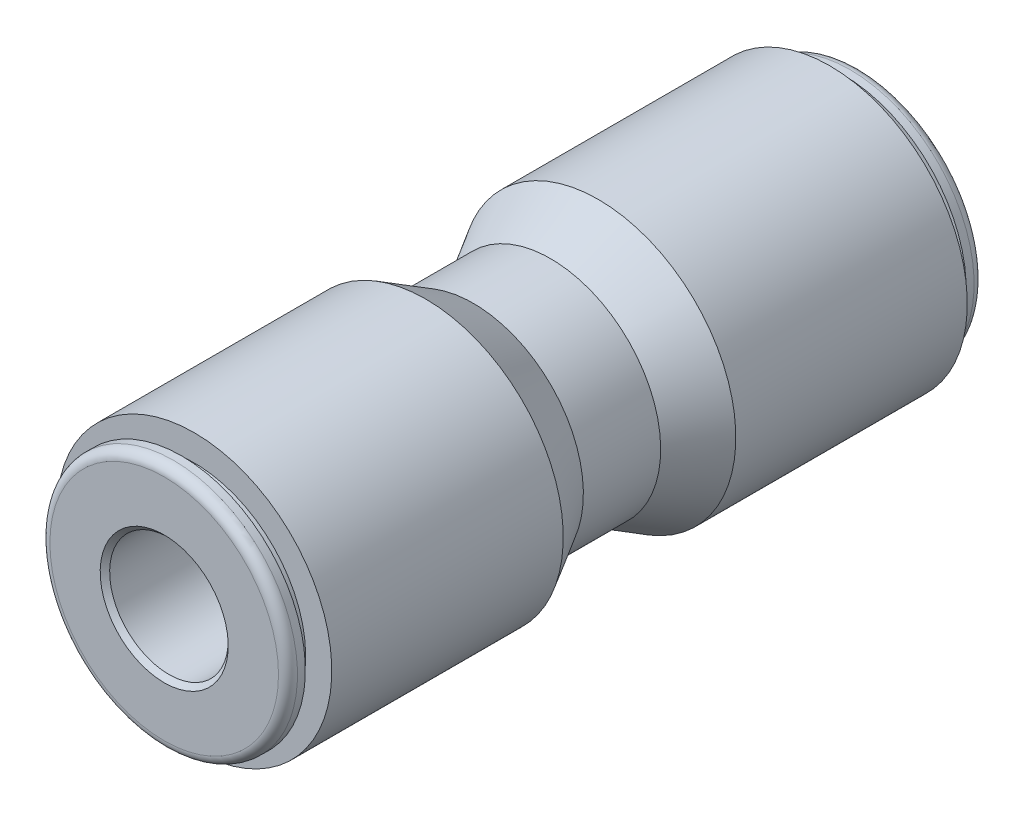
ISO-10303-21;
HEADER;
FILE_DESCRIPTION(('STEP AP214'),'2;1');
FILE_NAME('part.step','',(''),(''),'','','');
FILE_SCHEMA(('AUTOMOTIVE_DESIGN { 1 0 10303 214 1 1 1 1 }'));
ENDSEC;
DATA;
#1=APPLICATION_CONTEXT('core data for automotive mechanical design processes');
#2=APPLICATION_PROTOCOL_DEFINITION('international standard','automotive_design',2000,#1);
#3=PRODUCT_CONTEXT('',#1,'mechanical');
#4=PRODUCT('Part','Part','',(#3));
#5=PRODUCT_RELATED_PRODUCT_CATEGORY('part','',(#4));
#6=PRODUCT_DEFINITION_FORMATION('','',#4);
#7=PRODUCT_DEFINITION_CONTEXT('part definition',#1,'design');
#8=PRODUCT_DEFINITION('design','',#6,#7);
#9=PRODUCT_DEFINITION_SHAPE('','',#8);
#10=(LENGTH_UNIT() NAMED_UNIT(*) SI_UNIT(.MILLI.,.METRE.));
#11=(NAMED_UNIT(*) PLANE_ANGLE_UNIT() SI_UNIT($,.RADIAN.));
#12=(NAMED_UNIT(*) SI_UNIT($,.STERADIAN.) SOLID_ANGLE_UNIT());
#13=UNCERTAINTY_MEASURE_WITH_UNIT(LENGTH_MEASURE(1.E-05),#10,'distance_accuracy_value','');
#14=(GEOMETRIC_REPRESENTATION_CONTEXT(3) GLOBAL_UNCERTAINTY_ASSIGNED_CONTEXT((#13)) GLOBAL_UNIT_ASSIGNED_CONTEXT((#10,
#11,#12)) REPRESENTATION_CONTEXT('',''));
#15=CARTESIAN_POINT('',(0.,0.,0.));
#16=DIRECTION('',(0.,0.,1.));
#17=DIRECTION('',(1.,0.,0.));
#18=AXIS2_PLACEMENT_3D('',#15,#16,#17);
#19=CARTESIAN_POINT('',(0.,0.,0.));
#20=DIRECTION('',(0.,0.,1.));
#21=DIRECTION('',(0.,-1.,0.));
#22=AXIS2_PLACEMENT_3D('',#19,#20,#21);
#23=CYLINDRICAL_SURFACE('',#22,8.8392);
#24=CARTESIAN_POINT('',(0.,0.,3.10444444444445));
#25=DIRECTION('',(0.,0.,1.));
#26=DIRECTION('',(0.,-1.,0.));
#27=AXIS2_PLACEMENT_3D('',#24,#25,#26);
#28=CIRCLE('',#27,8.8392);
#29=CARTESIAN_POINT('',(0.,-8.8392,3.10444444444445));
#30=VERTEX_POINT('',#29);
#31=EDGE_CURVE('E108',#30,#30,#28,.T.);
#32=ORIENTED_EDGE('',*,*,#31,.F.);
#33=EDGE_LOOP('',(#32));
#34=FACE_BOUND('',#33,.T.);
#35=CARTESIAN_POINT('',(0.,0.,-3.10444444444445));
#36=DIRECTION('',(0.,0.,1.));
#37=DIRECTION('',(0.,-1.,0.));
#38=AXIS2_PLACEMENT_3D('',#35,#36,#37);
#39=CIRCLE('',#38,8.8392);
#40=CARTESIAN_POINT('',(0.,-8.8392,-3.10444444444445));
#41=VERTEX_POINT('',#40);
#42=EDGE_CURVE('E10',#41,#41,#39,.T.);
#43=ORIENTED_EDGE('',*,*,#42,.T.);
#44=EDGE_LOOP('',(#43));
#45=FACE_BOUND('',#44,.T.);
#46=ADVANCED_FACE('F32',(#34,#45),#23,.T.);
#47=CARTESIAN_POINT('',(0.,0.,-6.93193031901014));
#48=DIRECTION('',(0.,0.,-1.));
#49=DIRECTION('',(0.,1.,0.));
#50=AXIS2_PLACEMENT_3D('',#47,#48,#49);
#51=CONICAL_SURFACE('',#50,11.049,0.523598775598301);
#52=ORIENTED_EDGE('',*,*,#42,.F.);
#53=EDGE_LOOP('',(#52));
#54=FACE_BOUND('',#53,.T.);
#55=CARTESIAN_POINT('',(0.,0.,-6.93193031901014));
#56=DIRECTION('',(0.,0.,1.));
#57=DIRECTION('',(0.,-1.,0.));
#58=AXIS2_PLACEMENT_3D('',#55,#56,#57);
#59=CIRCLE('',#58,11.049);
#60=CARTESIAN_POINT('',(0.,-11.049,-6.93193031901014));
#61=VERTEX_POINT('',#60);
#62=EDGE_CURVE('E38',#61,#61,#59,.T.);
#63=ORIENTED_EDGE('',*,*,#62,.T.);
#64=EDGE_LOOP('',(#63));
#65=FACE_BOUND('',#64,.T.);
#66=ADVANCED_FACE('F115',(#54,#65),#51,.T.);
#67=CARTESIAN_POINT('',(0.,0.,0.));
#68=DIRECTION('',(0.,0.,1.));
#69=DIRECTION('',(0.,-1.,0.));
#70=AXIS2_PLACEMENT_3D('',#67,#68,#69);
#71=CYLINDRICAL_SURFACE('',#70,11.049);
#72=ORIENTED_EDGE('',*,*,#62,.F.);
#73=EDGE_LOOP('',(#72));
#74=FACE_BOUND('',#73,.T.);
#75=CARTESIAN_POINT('',(0.,0.,-25.527));
#76=DIRECTION('',(0.,0.,1.));
#77=DIRECTION('',(0.,-1.,0.));
#78=AXIS2_PLACEMENT_3D('',#75,#76,#77);
#79=CIRCLE('',#78,11.049);
#80=CARTESIAN_POINT('',(0.,-11.049,-25.527));
#81=VERTEX_POINT('',#80);
#82=EDGE_CURVE('E42',#81,#81,#79,.T.);
#83=ORIENTED_EDGE('',*,*,#82,.T.);
#84=EDGE_LOOP('',(#83));
#85=FACE_BOUND('',#84,.T.);
#86=ADVANCED_FACE('F119',(#74,#85),#71,.T.);
#87=CARTESIAN_POINT('',(0.,11.049,-25.527));
#88=DIRECTION('',(0.,0.,1.));
#89=DIRECTION('',(0.,-1.,0.));
#90=AXIS2_PLACEMENT_3D('',#87,#88,#89);
#91=PLANE('',#90);
#92=ORIENTED_EDGE('',*,*,#82,.F.);
#93=EDGE_LOOP('',(#92));
#94=FACE_BOUND('',#93,.T.);
#95=CARTESIAN_POINT('',(0.,0.,-25.527));
#96=DIRECTION('',(0.,0.,1.));
#97=DIRECTION('',(0.,-1.,0.));
#98=AXIS2_PLACEMENT_3D('',#95,#96,#97);
#99=CIRCLE('',#98,8.94969);
#100=CARTESIAN_POINT('',(0.,-8.94969,-25.527));
#101=VERTEX_POINT('',#100);
#102=EDGE_CURVE('E46',#101,#101,#99,.T.);
#103=ORIENTED_EDGE('',*,*,#102,.T.);
#104=EDGE_LOOP('',(#103));
#105=FACE_BOUND('',#104,.T.);
#106=ADVANCED_FACE('F124',(#94,#105),#91,.F.);
#107=CARTESIAN_POINT('',(0.,0.,0.));
#108=DIRECTION('',(0.,0.,1.));
#109=DIRECTION('',(0.,-1.,0.));
#110=AXIS2_PLACEMENT_3D('',#107,#108,#109);
#111=CYLINDRICAL_SURFACE('',#110,8.94969);
#112=ORIENTED_EDGE('',*,*,#102,.F.);
#113=EDGE_LOOP('',(#112));
#114=FACE_BOUND('',#113,.T.);
#115=CARTESIAN_POINT('',(0.,0.,-26.543));
#116=DIRECTION('',(0.,0.,1.));
#117=DIRECTION('',(0.,-1.,0.));
#118=AXIS2_PLACEMENT_3D('',#115,#116,#117);
#119=CIRCLE('',#118,8.94969);
#120=CARTESIAN_POINT('',(0.,-8.94969,-26.543));
#121=VERTEX_POINT('',#120);
#122=EDGE_CURVE('E51',#121,#121,#119,.T.);
#123=ORIENTED_EDGE('',*,*,#122,.T.);
#124=EDGE_LOOP('',(#123));
#125=FACE_BOUND('',#124,.T.);
#126=ADVANCED_FACE('F130',(#114,#125),#111,.T.);
#127=CARTESIAN_POINT('',(0.,9.9441,-26.543));
#128=DIRECTION('',(0.,0.,-1.));
#129=DIRECTION('',(0.,1.,0.));
#130=AXIS2_PLACEMENT_3D('',#127,#128,#129);
#131=PLANE('',#130);
#132=ORIENTED_EDGE('',*,*,#122,.F.);
#133=EDGE_LOOP('',(#132));
#134=FACE_BOUND('',#133,.T.);
#135=CARTESIAN_POINT('',(0.,0.,-26.543));
#136=DIRECTION('',(0.,0.,1.));
#137=DIRECTION('',(0.,-1.,0.));
#138=AXIS2_PLACEMENT_3D('',#135,#136,#137);
#139=CIRCLE('',#138,9.9441);
#140=CARTESIAN_POINT('',(0.,-9.9441,-26.543));
#141=VERTEX_POINT('',#140);
#142=EDGE_CURVE('E54',#141,#141,#139,.T.);
#143=ORIENTED_EDGE('',*,*,#142,.T.);
#144=EDGE_LOOP('',(#143));
#145=FACE_BOUND('',#144,.T.);
#146=ADVANCED_FACE('F134',(#134,#145),#131,.F.);
#147=CARTESIAN_POINT('',(0.,0.,0.));
#148=DIRECTION('',(0.,0.,1.));
#149=DIRECTION('',(0.,-1.,0.));
#150=AXIS2_PLACEMENT_3D('',#147,#148,#149);
#151=CYLINDRICAL_SURFACE('',#150,9.9441);
#152=ORIENTED_EDGE('',*,*,#142,.F.);
#153=EDGE_LOOP('',(#152));
#154=FACE_BOUND('',#153,.T.);
#155=CARTESIAN_POINT('',(0.,0.,-27.178));
#156=DIRECTION('',(0.,0.,1.));
#157=DIRECTION('',(0.,-1.,0.));
#158=AXIS2_PLACEMENT_3D('',#155,#156,#157);
#159=CIRCLE('',#158,9.9441);
#160=CARTESIAN_POINT('',(0.,-9.9441,-27.178));
#161=VERTEX_POINT('',#160);
#162=EDGE_CURVE('E57',#161,#161,#159,.T.);
#163=ORIENTED_EDGE('',*,*,#162,.T.);
#164=EDGE_LOOP('',(#163));
#165=FACE_BOUND('',#164,.T.);
#166=ADVANCED_FACE('F138',(#154,#165),#151,.T.);
#167=CARTESIAN_POINT('',(0.,0.,-27.178));
#168=DIRECTION('',(0.,0.,1.));
#169=DIRECTION('',(0.,-1.,0.));
#170=AXIS2_PLACEMENT_3D('',#167,#168,#169);
#171=TOROIDAL_SURFACE('',#170,9.1821,0.761999999999997);
#172=ORIENTED_EDGE('',*,*,#162,.F.);
#173=EDGE_LOOP('',(#172));
#174=FACE_BOUND('',#173,.T.);
#175=CARTESIAN_POINT('',(0.,0.,-27.94));
#176=DIRECTION('',(0.,0.,1.));
#177=DIRECTION('',(0.,-1.,0.));
#178=AXIS2_PLACEMENT_3D('',#175,#176,#177);
#179=CIRCLE('',#178,9.1821);
#180=CARTESIAN_POINT('',(0.,-9.1821,-27.94));
#181=VERTEX_POINT('',#180);
#182=EDGE_CURVE('E60',#181,#181,#179,.T.);
#183=ORIENTED_EDGE('',*,*,#182,.T.);
#184=EDGE_LOOP('',(#183));
#185=FACE_BOUND('',#184,.T.);
#186=ADVANCED_FACE('F142',(#174,#185),#171,.T.);
#187=CARTESIAN_POINT('',(0.,9.1821,-27.94));
#188=DIRECTION('',(0.,0.,1.));
#189=DIRECTION('',(0.,-1.,0.));
#190=AXIS2_PLACEMENT_3D('',#187,#188,#189);
#191=PLANE('',#190);
#192=ORIENTED_EDGE('',*,*,#182,.F.);
#193=EDGE_LOOP('',(#192));
#194=FACE_BOUND('',#193,.T.);
#195=CARTESIAN_POINT('',(0.,0.,-27.94));
#196=DIRECTION('',(0.,0.,1.));
#197=DIRECTION('',(0.,-1.,0.));
#198=AXIS2_PLACEMENT_3D('',#195,#196,#197);
#199=CIRCLE('',#198,6.731);
#200=CARTESIAN_POINT('',(0.,-6.731,-27.94));
#201=VERTEX_POINT('',#200);
#202=EDGE_CURVE('E63',#201,#201,#199,.T.);
#203=ORIENTED_EDGE('',*,*,#202,.T.);
#204=EDGE_LOOP('',(#203));
#205=FACE_BOUND('',#204,.T.);
#206=ADVANCED_FACE('F146',(#194,#205),#191,.F.);
#207=CARTESIAN_POINT('',(0.,0.,-27.559));
#208=DIRECTION('',(0.,0.,-1.));
#209=DIRECTION('',(0.,1.,0.));
#210=AXIS2_PLACEMENT_3D('',#207,#208,#209);
#211=CONICAL_SURFACE('',#210,6.35,0.785398163397457);
#212=ORIENTED_EDGE('',*,*,#202,.F.);
#213=EDGE_LOOP('',(#212));
#214=FACE_BOUND('',#213,.T.);
#215=CARTESIAN_POINT('',(0.,0.,-27.559));
#216=DIRECTION('',(0.,0.,1.));
#217=DIRECTION('',(0.,-1.,0.));
#218=AXIS2_PLACEMENT_3D('',#215,#216,#217);
#219=CIRCLE('',#218,6.35);
#220=CARTESIAN_POINT('',(0.,-6.35,-27.559));
#221=VERTEX_POINT('',#220);
#222=EDGE_CURVE('E66',#221,#221,#219,.T.);
#223=ORIENTED_EDGE('',*,*,#222,.T.);
#224=EDGE_LOOP('',(#223));
#225=FACE_BOUND('',#224,.T.);
#226=ADVANCED_FACE('F150',(#214,#225),#211,.F.);
#227=CARTESIAN_POINT('',(0.,0.,0.));
#228=DIRECTION('',(0.,0.,1.));
#229=DIRECTION('',(0.,-1.,0.));
#230=AXIS2_PLACEMENT_3D('',#227,#228,#229);
#231=CYLINDRICAL_SURFACE('',#230,6.35);
#232=ORIENTED_EDGE('',*,*,#222,.F.);
#233=EDGE_LOOP('',(#232));
#234=FACE_BOUND('',#233,.T.);
#235=CARTESIAN_POINT('',(0.,0.,-0.254000000000004));
#236=DIRECTION('',(0.,0.,1.));
#237=DIRECTION('',(0.,-1.,0.));
#238=AXIS2_PLACEMENT_3D('',#235,#236,#237);
#239=CIRCLE('',#238,6.35);
#240=CARTESIAN_POINT('',(0.,-6.35,-0.254000000000004));
#241=VERTEX_POINT('',#240);
#242=EDGE_CURVE('E69',#241,#241,#239,.T.);
#243=ORIENTED_EDGE('',*,*,#242,.T.);
#244=EDGE_LOOP('',(#243));
#245=FACE_BOUND('',#244,.T.);
#246=ADVANCED_FACE('F154',(#234,#245),#231,.F.);
#247=CARTESIAN_POINT('',(0.,6.35,-0.254000000000004));
#248=DIRECTION('',(0.,0.,1.));
#249=DIRECTION('',(0.,-1.,0.));
#250=AXIS2_PLACEMENT_3D('',#247,#248,#249);
#251=PLANE('',#250);
#252=ORIENTED_EDGE('',*,*,#242,.F.);
#253=EDGE_LOOP('',(#252));
#254=FACE_BOUND('',#253,.T.);
#255=CARTESIAN_POINT('',(0.,0.,-0.254000000000004));
#256=DIRECTION('',(0.,0.,1.));
#257=DIRECTION('',(0.,-1.,0.));
#258=AXIS2_PLACEMENT_3D('',#255,#256,#257);
#259=CIRCLE('',#258,3.175);
#260=CARTESIAN_POINT('',(0.,-3.175,-0.254000000000004));
#261=VERTEX_POINT('',#260);
#262=EDGE_CURVE('E72',#261,#261,#259,.T.);
#263=ORIENTED_EDGE('',*,*,#262,.T.);
#264=EDGE_LOOP('',(#263));
#265=FACE_BOUND('',#264,.T.);
#266=ADVANCED_FACE('F158',(#254,#265),#251,.F.);
#267=CARTESIAN_POINT('',(0.,0.,0.));
#268=DIRECTION('',(0.,0.,1.));
#269=DIRECTION('',(0.,-1.,0.));
#270=AXIS2_PLACEMENT_3D('',#267,#268,#269);
#271=CYLINDRICAL_SURFACE('',#270,3.175);
#272=ORIENTED_EDGE('',*,*,#262,.F.);
#273=EDGE_LOOP('',(#272));
#274=FACE_BOUND('',#273,.T.);
#275=CARTESIAN_POINT('',(0.,0.,7.112));
#276=DIRECTION('',(0.,0.,1.));
#277=DIRECTION('',(0.,-1.,0.));
#278=AXIS2_PLACEMENT_3D('',#275,#276,#277);
#279=CIRCLE('',#278,3.175);
#280=CARTESIAN_POINT('',(0.,-3.175,7.112));
#281=VERTEX_POINT('',#280);
#282=EDGE_CURVE('E75',#281,#281,#279,.T.);
#283=ORIENTED_EDGE('',*,*,#282,.T.);
#284=EDGE_LOOP('',(#283));
#285=FACE_BOUND('',#284,.T.);
#286=ADVANCED_FACE('F162',(#274,#285),#271,.F.);
#287=CARTESIAN_POINT('',(0.,3.175,7.112));
#288=DIRECTION('',(0.,0.,-1.));
#289=DIRECTION('',(0.,1.,0.));
#290=AXIS2_PLACEMENT_3D('',#287,#288,#289);
#291=PLANE('',#290);
#292=ORIENTED_EDGE('',*,*,#282,.F.);
#293=EDGE_LOOP('',(#292));
#294=FACE_BOUND('',#293,.T.);
#295=CARTESIAN_POINT('',(0.,0.,7.112));
#296=DIRECTION('',(0.,0.,1.));
#297=DIRECTION('',(0.,-1.,0.));
#298=AXIS2_PLACEMENT_3D('',#295,#296,#297);
#299=CIRCLE('',#298,4.7625);
#300=CARTESIAN_POINT('',(0.,-4.7625,7.112));
#301=VERTEX_POINT('',#300);
#302=EDGE_CURVE('E78',#301,#301,#299,.T.);
#303=ORIENTED_EDGE('',*,*,#302,.T.);
#304=EDGE_LOOP('',(#303));
#305=FACE_BOUND('',#304,.T.);
#306=ADVANCED_FACE('F166',(#294,#305),#291,.F.);
#307=CARTESIAN_POINT('',(0.,0.,0.));
#308=DIRECTION('',(0.,0.,1.));
#309=DIRECTION('',(0.,-1.,0.));
#310=AXIS2_PLACEMENT_3D('',#307,#308,#309);
#311=CYLINDRICAL_SURFACE('',#310,4.7625);
#312=ORIENTED_EDGE('',*,*,#302,.F.);
#313=EDGE_LOOP('',(#312));
#314=FACE_BOUND('',#313,.T.);
#315=CARTESIAN_POINT('',(0.,0.,27.559));
#316=DIRECTION('',(0.,0.,1.));
#317=DIRECTION('',(0.,-1.,0.));
#318=AXIS2_PLACEMENT_3D('',#315,#316,#317);
#319=CIRCLE('',#318,4.7625);
#320=CARTESIAN_POINT('',(0.,-4.7625,27.559));
#321=VERTEX_POINT('',#320);
#322=EDGE_CURVE('E81',#321,#321,#319,.T.);
#323=ORIENTED_EDGE('',*,*,#322,.T.);
#324=EDGE_LOOP('',(#323));
#325=FACE_BOUND('',#324,.T.);
#326=ADVANCED_FACE('F170',(#314,#325),#311,.F.);
#327=CARTESIAN_POINT('',(0.,0.,27.94));
#328=DIRECTION('',(0.,0.,1.));
#329=DIRECTION('',(0.,-1.,0.));
#330=AXIS2_PLACEMENT_3D('',#327,#328,#329);
#331=CONICAL_SURFACE('',#330,5.1435,0.785398163397444);
#332=ORIENTED_EDGE('',*,*,#322,.F.);
#333=EDGE_LOOP('',(#332));
#334=FACE_BOUND('',#333,.T.);
#335=CARTESIAN_POINT('',(0.,0.,27.94));
#336=DIRECTION('',(0.,0.,1.));
#337=DIRECTION('',(0.,-1.,0.));
#338=AXIS2_PLACEMENT_3D('',#335,#336,#337);
#339=CIRCLE('',#338,5.1435);
#340=CARTESIAN_POINT('',(0.,-5.1435,27.94));
#341=VERTEX_POINT('',#340);
#342=EDGE_CURVE('E84',#341,#341,#339,.T.);
#343=ORIENTED_EDGE('',*,*,#342,.T.);
#344=EDGE_LOOP('',(#343));
#345=FACE_BOUND('',#344,.T.);
#346=ADVANCED_FACE('F174',(#334,#345),#331,.F.);
#347=CARTESIAN_POINT('',(0.,9.1821,27.94));
#348=DIRECTION('',(0.,0.,-1.));
#349=DIRECTION('',(0.,1.,0.));
#350=AXIS2_PLACEMENT_3D('',#347,#348,#349);
#351=PLANE('',#350);
#352=ORIENTED_EDGE('',*,*,#342,.F.);
#353=EDGE_LOOP('',(#352));
#354=FACE_BOUND('',#353,.T.);
#355=CARTESIAN_POINT('',(0.,0.,27.94));
#356=DIRECTION('',(0.,0.,1.));
#357=DIRECTION('',(0.,-1.,0.));
#358=AXIS2_PLACEMENT_3D('',#355,#356,#357);
#359=CIRCLE('',#358,9.1821);
#360=CARTESIAN_POINT('',(0.,-9.1821,27.94));
#361=VERTEX_POINT('',#360);
#362=EDGE_CURVE('E87',#361,#361,#359,.T.);
#363=ORIENTED_EDGE('',*,*,#362,.T.);
#364=EDGE_LOOP('',(#363));
#365=FACE_BOUND('',#364,.T.);
#366=ADVANCED_FACE('F178',(#354,#365),#351,.F.);
#367=CARTESIAN_POINT('',(0.,0.,27.178));
#368=DIRECTION('',(0.,0.,1.));
#369=DIRECTION('',(0.,-1.,0.));
#370=AXIS2_PLACEMENT_3D('',#367,#368,#369);
#371=TOROIDAL_SURFACE('',#370,9.1821,0.761999999999997);
#372=ORIENTED_EDGE('',*,*,#362,.F.);
#373=EDGE_LOOP('',(#372));
#374=FACE_BOUND('',#373,.T.);
#375=CARTESIAN_POINT('',(0.,0.,27.178));
#376=DIRECTION('',(0.,0.,1.));
#377=DIRECTION('',(0.,-1.,0.));
#378=AXIS2_PLACEMENT_3D('',#375,#376,#377);
#379=CIRCLE('',#378,9.9441);
#380=CARTESIAN_POINT('',(0.,-9.9441,27.178));
#381=VERTEX_POINT('',#380);
#382=EDGE_CURVE('E90',#381,#381,#379,.T.);
#383=ORIENTED_EDGE('',*,*,#382,.T.);
#384=EDGE_LOOP('',(#383));
#385=FACE_BOUND('',#384,.T.);
#386=ADVANCED_FACE('F182',(#374,#385),#371,.T.);
#387=CARTESIAN_POINT('',(0.,0.,0.));
#388=DIRECTION('',(0.,0.,1.));
#389=DIRECTION('',(0.,-1.,0.));
#390=AXIS2_PLACEMENT_3D('',#387,#388,#389);
#391=CYLINDRICAL_SURFACE('',#390,9.9441);
#392=ORIENTED_EDGE('',*,*,#382,.F.);
#393=EDGE_LOOP('',(#392));
#394=FACE_BOUND('',#393,.T.);
#395=CARTESIAN_POINT('',(0.,0.,26.543));
#396=DIRECTION('',(0.,0.,1.));
#397=DIRECTION('',(0.,-1.,0.));
#398=AXIS2_PLACEMENT_3D('',#395,#396,#397);
#399=CIRCLE('',#398,9.9441);
#400=CARTESIAN_POINT('',(0.,-9.9441,26.543));
#401=VERTEX_POINT('',#400);
#402=EDGE_CURVE('E93',#401,#401,#399,.T.);
#403=ORIENTED_EDGE('',*,*,#402,.T.);
#404=EDGE_LOOP('',(#403));
#405=FACE_BOUND('',#404,.T.);
#406=ADVANCED_FACE('F186',(#394,#405),#391,.T.);
#407=CARTESIAN_POINT('',(0.,9.9441,26.543));
#408=DIRECTION('',(0.,0.,1.));
#409=DIRECTION('',(0.,-1.,0.));
#410=AXIS2_PLACEMENT_3D('',#407,#408,#409);
#411=PLANE('',#410);
#412=ORIENTED_EDGE('',*,*,#402,.F.);
#413=EDGE_LOOP('',(#412));
#414=FACE_BOUND('',#413,.T.);
#415=CARTESIAN_POINT('',(0.,0.,26.543));
#416=DIRECTION('',(0.,0.,1.));
#417=DIRECTION('',(0.,-1.,0.));
#418=AXIS2_PLACEMENT_3D('',#415,#416,#417);
#419=CIRCLE('',#418,8.94969);
#420=CARTESIAN_POINT('',(0.,-8.94969,26.543));
#421=VERTEX_POINT('',#420);
#422=EDGE_CURVE('E96',#421,#421,#419,.T.);
#423=ORIENTED_EDGE('',*,*,#422,.T.);
#424=EDGE_LOOP('',(#423));
#425=FACE_BOUND('',#424,.T.);
#426=ADVANCED_FACE('F190',(#414,#425),#411,.F.);
#427=CARTESIAN_POINT('',(0.,0.,0.));
#428=DIRECTION('',(0.,0.,1.));
#429=DIRECTION('',(0.,-1.,0.));
#430=AXIS2_PLACEMENT_3D('',#427,#428,#429);
#431=CYLINDRICAL_SURFACE('',#430,8.94969);
#432=ORIENTED_EDGE('',*,*,#422,.F.);
#433=EDGE_LOOP('',(#432));
#434=FACE_BOUND('',#433,.T.);
#435=CARTESIAN_POINT('',(0.,0.,25.527));
#436=DIRECTION('',(0.,0.,1.));
#437=DIRECTION('',(0.,-1.,0.));
#438=AXIS2_PLACEMENT_3D('',#435,#436,#437);
#439=CIRCLE('',#438,8.94969);
#440=CARTESIAN_POINT('',(0.,-8.94969,25.527));
#441=VERTEX_POINT('',#440);
#442=EDGE_CURVE('E99',#441,#441,#439,.T.);
#443=ORIENTED_EDGE('',*,*,#442,.T.);
#444=EDGE_LOOP('',(#443));
#445=FACE_BOUND('',#444,.T.);
#446=ADVANCED_FACE('F194',(#434,#445),#431,.T.);
#447=CARTESIAN_POINT('',(0.,11.049,25.527));
#448=DIRECTION('',(0.,0.,-1.));
#449=DIRECTION('',(0.,1.,0.));
#450=AXIS2_PLACEMENT_3D('',#447,#448,#449);
#451=PLANE('',#450);
#452=ORIENTED_EDGE('',*,*,#442,.F.);
#453=EDGE_LOOP('',(#452));
#454=FACE_BOUND('',#453,.T.);
#455=CARTESIAN_POINT('',(0.,0.,25.527));
#456=DIRECTION('',(0.,0.,1.));
#457=DIRECTION('',(0.,-1.,0.));
#458=AXIS2_PLACEMENT_3D('',#455,#456,#457);
#459=CIRCLE('',#458,11.049);
#460=CARTESIAN_POINT('',(0.,-11.049,25.527));
#461=VERTEX_POINT('',#460);
#462=EDGE_CURVE('E102',#461,#461,#459,.T.);
#463=ORIENTED_EDGE('',*,*,#462,.T.);
#464=EDGE_LOOP('',(#463));
#465=FACE_BOUND('',#464,.T.);
#466=ADVANCED_FACE('F198',(#454,#465),#451,.F.);
#467=CARTESIAN_POINT('',(0.,0.,0.));
#468=DIRECTION('',(0.,0.,1.));
#469=DIRECTION('',(0.,-1.,0.));
#470=AXIS2_PLACEMENT_3D('',#467,#468,#469);
#471=CYLINDRICAL_SURFACE('',#470,11.049);
#472=ORIENTED_EDGE('',*,*,#462,.F.);
#473=EDGE_LOOP('',(#472));
#474=FACE_BOUND('',#473,.T.);
#475=CARTESIAN_POINT('',(0.,0.,6.93193031901014));
#476=DIRECTION('',(0.,0.,1.));
#477=DIRECTION('',(0.,-1.,0.));
#478=AXIS2_PLACEMENT_3D('',#475,#476,#477);
#479=CIRCLE('',#478,11.049);
#480=CARTESIAN_POINT('',(0.,-11.049,6.93193031901014));
#481=VERTEX_POINT('',#480);
#482=EDGE_CURVE('E105',#481,#481,#479,.T.);
#483=ORIENTED_EDGE('',*,*,#482,.T.);
#484=EDGE_LOOP('',(#483));
#485=FACE_BOUND('',#484,.T.);
#486=ADVANCED_FACE('F202',(#474,#485),#471,.T.);
#487=CARTESIAN_POINT('',(0.,0.,3.10444444444445));
#488=DIRECTION('',(0.,0.,1.));
#489=DIRECTION('',(0.,-1.,0.));
#490=AXIS2_PLACEMENT_3D('',#487,#488,#489);
#491=CONICAL_SURFACE('',#490,8.8392,0.523598775598301);
#492=ORIENTED_EDGE('',*,*,#482,.F.);
#493=EDGE_LOOP('',(#492));
#494=FACE_BOUND('',#493,.T.);
#495=ORIENTED_EDGE('',*,*,#31,.T.);
#496=EDGE_LOOP('',(#495));
#497=FACE_BOUND('',#496,.T.);
#498=ADVANCED_FACE('F112',(#494,#497),#491,.T.);
#499=CLOSED_SHELL('',(#46,#66,#86,#106,#126,#146,#166,#186,#206,#226,#246,#266,#286,#306,#326,
#346,#366,#386,#406,#426,#446,#466,#486,#498));
#500=MANIFOLD_SOLID_BREP('B2',#499);
#501=ADVANCED_BREP_SHAPE_REPRESENTATION('',(#18,#500),#14);
#502=SHAPE_DEFINITION_REPRESENTATION(#9,#501);
ENDSEC;
END-ISO-10303-21;
